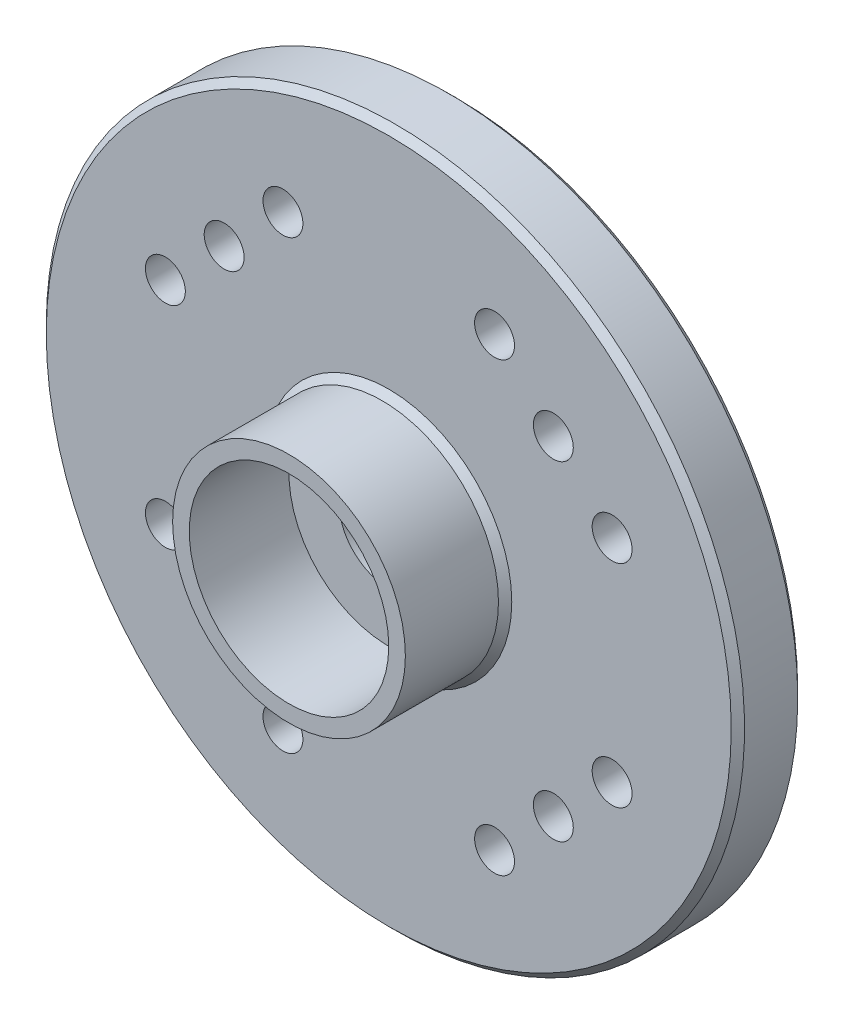
ISO-10303-21;
HEADER;
FILE_DESCRIPTION(('STEP AP214'),'2;1');
FILE_NAME('part.step','',(''),(''),'','','');
FILE_SCHEMA(('AUTOMOTIVE_DESIGN { 1 0 10303 214 1 1 1 1 }'));
ENDSEC;
DATA;
#1=APPLICATION_CONTEXT('core data for automotive mechanical design processes');
#2=APPLICATION_PROTOCOL_DEFINITION('international standard','automotive_design',2000,#1);
#3=PRODUCT_CONTEXT('',#1,'mechanical');
#4=PRODUCT('Part','Part','',(#3));
#5=PRODUCT_RELATED_PRODUCT_CATEGORY('part','',(#4));
#6=PRODUCT_DEFINITION_FORMATION('','',#4);
#7=PRODUCT_DEFINITION_CONTEXT('part definition',#1,'design');
#8=PRODUCT_DEFINITION('design','',#6,#7);
#9=PRODUCT_DEFINITION_SHAPE('','',#8);
#10=(LENGTH_UNIT() NAMED_UNIT(*) SI_UNIT(.MILLI.,.METRE.));
#11=(NAMED_UNIT(*) PLANE_ANGLE_UNIT() SI_UNIT($,.RADIAN.));
#12=(NAMED_UNIT(*) SI_UNIT($,.STERADIAN.) SOLID_ANGLE_UNIT());
#13=UNCERTAINTY_MEASURE_WITH_UNIT(LENGTH_MEASURE(1.E-05),#10,'distance_accuracy_value','');
#14=(GEOMETRIC_REPRESENTATION_CONTEXT(3) GLOBAL_UNCERTAINTY_ASSIGNED_CONTEXT((#13)) GLOBAL_UNIT_ASSIGNED_CONTEXT((#10,
#11,#12)) REPRESENTATION_CONTEXT('',''));
#15=CARTESIAN_POINT('',(0.,0.,0.));
#16=DIRECTION('',(0.,0.,1.));
#17=DIRECTION('',(1.,0.,0.));
#18=AXIS2_PLACEMENT_3D('',#15,#16,#17);
#19=CARTESIAN_POINT('',(0.,0.,2.));
#20=DIRECTION('',(0.,0.,-1.));
#21=DIRECTION('',(-1.,0.,0.));
#22=AXIS2_PLACEMENT_3D('',#19,#20,#21);
#23=CYLINDRICAL_SURFACE('',#22,1.5);
#24=CARTESIAN_POINT('',(0.,0.,2.));
#25=DIRECTION('',(0.,0.,1.));
#26=DIRECTION('',(1.,0.,0.));
#27=AXIS2_PLACEMENT_3D('',#24,#25,#26);
#28=CIRCLE('',#27,1.5);
#29=CARTESIAN_POINT('',(1.5,0.,2.));
#30=VERTEX_POINT('',#29);
#31=EDGE_CURVE('E71',#30,#30,#28,.T.);
#32=ORIENTED_EDGE('',*,*,#31,.T.);
#33=EDGE_LOOP('',(#32));
#34=FACE_BOUND('',#33,.T.);
#35=CARTESIAN_POINT('',(0.,0.,1.));
#36=DIRECTION('',(0.,0.,-1.));
#37=DIRECTION('',(-1.,0.,0.));
#38=AXIS2_PLACEMENT_3D('',#35,#36,#37);
#39=CIRCLE('',#38,1.5);
#40=CARTESIAN_POINT('',(-1.5,0.,1.));
#41=VERTEX_POINT('',#40);
#42=EDGE_CURVE('E64',#41,#41,#39,.T.);
#43=ORIENTED_EDGE('',*,*,#42,.T.);
#44=EDGE_LOOP('',(#43));
#45=FACE_BOUND('',#44,.T.);
#46=ADVANCED_FACE('F36',(#34,#45),#23,.F.);
#47=CARTESIAN_POINT('',(0.,0.,2.));
#48=DIRECTION('',(0.,0.,1.));
#49=DIRECTION('',(1.,0.,0.));
#50=AXIS2_PLACEMENT_3D('',#47,#48,#49);
#51=PLANE('',#50);
#52=ORIENTED_EDGE('',*,*,#31,.F.);
#53=EDGE_LOOP('',(#52));
#54=FACE_BOUND('',#53,.T.);
#55=CARTESIAN_POINT('',(0.,0.,2.));
#56=DIRECTION('',(0.,0.,1.));
#57=DIRECTION('',(1.,0.,0.));
#58=AXIS2_PLACEMENT_3D('',#55,#56,#57);
#59=CIRCLE('',#58,3.);
#60=CARTESIAN_POINT('',(3.,0.,2.));
#61=VERTEX_POINT('',#60);
#62=EDGE_CURVE('E63',#61,#61,#59,.F.);
#63=ORIENTED_EDGE('',*,*,#62,.F.);
#64=EDGE_LOOP('',(#63));
#65=FACE_BOUND('',#64,.T.);
#66=ADVANCED_FACE('F171',(#54,#65),#51,.T.);
#67=CARTESIAN_POINT('',(0.,0.,2.));
#68=DIRECTION('',(0.,0.,1.));
#69=DIRECTION('',(1.,0.,0.));
#70=AXIS2_PLACEMENT_3D('',#67,#68,#69);
#71=CIRCLE('',#70,3.69999999999999);
#72=CARTESIAN_POINT('',(3.69999999999999,0.,2.));
#73=VERTEX_POINT('',#72);
#74=EDGE_CURVE('E52',#73,#73,#71,.F.);
#75=ORIENTED_EDGE('',*,*,#74,.T.);
#76=EDGE_LOOP('',(#75));
#77=FACE_BOUND('',#76,.T.);
#78=CARTESIAN_POINT('',(0.,0.,2.));
#79=DIRECTION('',(0.,0.,1.));
#80=DIRECTION('',(1.,0.,0.));
#81=AXIS2_PLACEMENT_3D('',#78,#79,#80);
#82=CIRCLE('',#81,10.3);
#83=CARTESIAN_POINT('',(-10.3,0.,2.));
#84=VERTEX_POINT('',#83);
#85=EDGE_CURVE('E57',#84,#84,#82,.T.);
#86=ORIENTED_EDGE('',*,*,#85,.T.);
#87=EDGE_LOOP('',(#86));
#88=FACE_BOUND('',#87,.T.);
#89=CARTESIAN_POINT('',(-6.7175144212722,3.18198051533946,2.));
#90=DIRECTION('',(0.,0.,1.));
#91=DIRECTION('',(-1.,0.,0.));
#92=AXIS2_PLACEMENT_3D('',#89,#90,#91);
#93=CIRCLE('',#92,0.6);
#94=CARTESIAN_POINT('',(-7.3175144212722,3.18198051533946,2.));
#95=VERTEX_POINT('',#94);
#96=EDGE_CURVE('E122',#95,#95,#93,.T.);
#97=ORIENTED_EDGE('',*,*,#96,.F.);
#98=EDGE_LOOP('',(#97));
#99=FACE_BOUND('',#98,.T.);
#100=CARTESIAN_POINT('',(6.7175144212724,3.18198051534006,2.));
#101=DIRECTION('',(0.,0.,1.));
#102=DIRECTION('',(1.,0.,0.));
#103=AXIS2_PLACEMENT_3D('',#100,#101,#102);
#104=CIRCLE('',#103,0.6);
#105=CARTESIAN_POINT('',(7.3175144212724,3.18198051534006,2.));
#106=VERTEX_POINT('',#105);
#107=EDGE_CURVE('E115',#106,#106,#104,.T.);
#108=ORIENTED_EDGE('',*,*,#107,.F.);
#109=EDGE_LOOP('',(#108));
#110=FACE_BOUND('',#109,.T.);
#111=CARTESIAN_POINT('',(3.18198051533966,6.71751442127279,2.));
#112=DIRECTION('',(0.,0.,1.));
#113=DIRECTION('',(-1.,0.,0.));
#114=AXIS2_PLACEMENT_3D('',#111,#112,#113);
#115=CIRCLE('',#114,0.600000000000001);
#116=CARTESIAN_POINT('',(2.58198051533966,6.71751442127279,2.));
#117=VERTEX_POINT('',#116);
#118=EDGE_CURVE('E134',#117,#117,#115,.T.);
#119=ORIENTED_EDGE('',*,*,#118,.F.);
#120=EDGE_LOOP('',(#119));
#121=FACE_BOUND('',#120,.T.);
#122=CARTESIAN_POINT('',(3.18198051534026,-6.71751442127181,2.));
#123=DIRECTION('',(0.,0.,1.));
#124=DIRECTION('',(1.,0.,0.));
#125=AXIS2_PLACEMENT_3D('',#122,#123,#124);
#126=CIRCLE('',#125,0.600000000000001);
#127=CARTESIAN_POINT('',(3.78198051534026,-6.71751442127181,2.));
#128=VERTEX_POINT('',#127);
#129=EDGE_CURVE('E127',#128,#128,#126,.T.);
#130=ORIENTED_EDGE('',*,*,#129,.F.);
#131=EDGE_LOOP('',(#130));
#132=FACE_BOUND('',#131,.T.);
#133=CARTESIAN_POINT('',(4.94974746830583,4.94974746830583,2.));
#134=DIRECTION('',(0.,0.,1.));
#135=DIRECTION('',(1.,0.,0.));
#136=AXIS2_PLACEMENT_3D('',#133,#134,#135);
#137=CIRCLE('',#136,0.6);
#138=CARTESIAN_POINT('',(5.54974746830583,4.94974746830583,2.));
#139=VERTEX_POINT('',#138);
#140=EDGE_CURVE('E98',#139,#139,#137,.T.);
#141=ORIENTED_EDGE('',*,*,#140,.F.);
#142=EDGE_LOOP('',(#141));
#143=FACE_BOUND('',#142,.T.);
#144=CARTESIAN_POINT('',(-4.94974746830583,-4.94974746830583,2.));
#145=DIRECTION('',(0.,0.,1.));
#146=DIRECTION('',(1.,0.,0.));
#147=AXIS2_PLACEMENT_3D('',#144,#145,#146);
#148=CIRCLE('',#147,0.6);
#149=CARTESIAN_POINT('',(-4.34974746830583,-4.94974746830583,2.));
#150=VERTEX_POINT('',#149);
#151=EDGE_CURVE('E91',#150,#150,#148,.T.);
#152=ORIENTED_EDGE('',*,*,#151,.F.);
#153=EDGE_LOOP('',(#152));
#154=FACE_BOUND('',#153,.T.);
#155=CARTESIAN_POINT('',(4.94974746830583,-4.94974746830583,2.));
#156=DIRECTION('',(0.,0.,1.));
#157=DIRECTION('',(1.,0.,0.));
#158=AXIS2_PLACEMENT_3D('',#155,#156,#157);
#159=CIRCLE('',#158,0.6);
#160=CARTESIAN_POINT('',(5.54974746830583,-4.94974746830583,2.));
#161=VERTEX_POINT('',#160);
#162=EDGE_CURVE('E110',#161,#161,#159,.T.);
#163=ORIENTED_EDGE('',*,*,#162,.F.);
#164=EDGE_LOOP('',(#163));
#165=FACE_BOUND('',#164,.T.);
#166=CARTESIAN_POINT('',(-3.18198051533946,6.7175144212722,2.));
#167=DIRECTION('',(0.,0.,1.));
#168=DIRECTION('',(1.,0.,0.));
#169=AXIS2_PLACEMENT_3D('',#166,#167,#168);
#170=CIRCLE('',#169,0.6);
#171=CARTESIAN_POINT('',(-2.58198051533947,6.7175144212722,2.));
#172=VERTEX_POINT('',#171);
#173=EDGE_CURVE('E103',#172,#172,#170,.T.);
#174=ORIENTED_EDGE('',*,*,#173,.F.);
#175=EDGE_LOOP('',(#174));
#176=FACE_BOUND('',#175,.T.);
#177=CARTESIAN_POINT('',(6.717514421273,-3.18198051533907,2.));
#178=DIRECTION('',(0.,0.,1.));
#179=DIRECTION('',(-1.,0.,0.));
#180=AXIS2_PLACEMENT_3D('',#177,#178,#179);
#181=CIRCLE('',#180,0.6);
#182=CARTESIAN_POINT('',(6.117514421273,-3.18198051533907,2.));
#183=VERTEX_POINT('',#182);
#184=EDGE_CURVE('E151',#183,#183,#181,.T.);
#185=ORIENTED_EDGE('',*,*,#184,.F.);
#186=EDGE_LOOP('',(#185));
#187=FACE_BOUND('',#186,.T.);
#188=CARTESIAN_POINT('',(-6.71751442127161,-3.18198051533967,2.));
#189=DIRECTION('',(0.,0.,1.));
#190=DIRECTION('',(1.,0.,0.));
#191=AXIS2_PLACEMENT_3D('',#188,#189,#190);
#192=CIRCLE('',#191,0.6);
#193=CARTESIAN_POINT('',(-6.11751442127161,-3.18198051533967,2.));
#194=VERTEX_POINT('',#193);
#195=EDGE_CURVE('E145',#194,#194,#192,.T.);
#196=ORIENTED_EDGE('',*,*,#195,.F.);
#197=EDGE_LOOP('',(#196));
#198=FACE_BOUND('',#197,.T.);
#199=CARTESIAN_POINT('',(-3.18198051533887,-6.7175144212724,2.));
#200=DIRECTION('',(0.,0.,1.));
#201=DIRECTION('',(-1.,0.,0.));
#202=AXIS2_PLACEMENT_3D('',#199,#200,#201);
#203=CIRCLE('',#202,0.6);
#204=CARTESIAN_POINT('',(-3.78198051533887,-6.7175144212724,2.));
#205=VERTEX_POINT('',#204);
#206=EDGE_CURVE('E139',#205,#205,#203,.T.);
#207=ORIENTED_EDGE('',*,*,#206,.F.);
#208=EDGE_LOOP('',(#207));
#209=FACE_BOUND('',#208,.T.);
#210=CARTESIAN_POINT('',(-4.94974746830583,4.94974746830583,2.));
#211=DIRECTION('',(0.,0.,1.));
#212=DIRECTION('',(1.,0.,0.));
#213=AXIS2_PLACEMENT_3D('',#210,#211,#212);
#214=CIRCLE('',#213,0.6);
#215=CARTESIAN_POINT('',(-4.34974746830583,4.94974746830583,2.));
#216=VERTEX_POINT('',#215);
#217=EDGE_CURVE('E85',#216,#216,#214,.T.);
#218=ORIENTED_EDGE('',*,*,#217,.F.);
#219=EDGE_LOOP('',(#218));
#220=FACE_BOUND('',#219,.T.);
#221=ADVANCED_FACE('F168',(#77,#88,#99,#110,#121,#132,#143,#154,#165,#176,#187,#198,#209,#220),
#51,.T.);
#222=CARTESIAN_POINT('',(0.,0.,0.));
#223=DIRECTION('',(0.,0.,1.));
#224=DIRECTION('',(1.,0.,0.));
#225=AXIS2_PLACEMENT_3D('',#222,#223,#224);
#226=PLANE('',#225);
#227=CARTESIAN_POINT('',(0.,0.,0.));
#228=DIRECTION('',(0.,0.,1.));
#229=DIRECTION('',(1.,0.,0.));
#230=AXIS2_PLACEMENT_3D('',#227,#228,#229);
#231=CIRCLE('',#230,10.3);
#232=CARTESIAN_POINT('',(10.3,0.,0.));
#233=VERTEX_POINT('',#232);
#234=EDGE_CURVE('E10',#233,#233,#231,.F.);
#235=ORIENTED_EDGE('',*,*,#234,.T.);
#236=EDGE_LOOP('',(#235));
#237=FACE_BOUND('',#236,.T.);
#238=CARTESIAN_POINT('',(-6.7175144212722,3.18198051533946,0.));
#239=DIRECTION('',(0.,0.,1.));
#240=DIRECTION('',(-1.,0.,0.));
#241=AXIS2_PLACEMENT_3D('',#238,#239,#240);
#242=CIRCLE('',#241,0.6);
#243=CARTESIAN_POINT('',(-7.3175144212722,3.18198051533946,0.));
#244=VERTEX_POINT('',#243);
#245=EDGE_CURVE('E107',#244,#244,#242,.T.);
#246=ORIENTED_EDGE('',*,*,#245,.T.);
#247=EDGE_LOOP('',(#246));
#248=FACE_BOUND('',#247,.T.);
#249=CARTESIAN_POINT('',(6.7175144212724,3.18198051534006,0.));
#250=DIRECTION('',(0.,0.,1.));
#251=DIRECTION('',(1.,0.,0.));
#252=AXIS2_PLACEMENT_3D('',#249,#250,#251);
#253=CIRCLE('',#252,0.6);
#254=CARTESIAN_POINT('',(7.3175144212724,3.18198051534006,0.));
#255=VERTEX_POINT('',#254);
#256=EDGE_CURVE('E118',#255,#255,#253,.T.);
#257=ORIENTED_EDGE('',*,*,#256,.T.);
#258=EDGE_LOOP('',(#257));
#259=FACE_BOUND('',#258,.T.);
#260=CARTESIAN_POINT('',(3.18198051533966,6.71751442127279,0.));
#261=DIRECTION('',(0.,0.,1.));
#262=DIRECTION('',(-1.,0.,0.));
#263=AXIS2_PLACEMENT_3D('',#260,#261,#262);
#264=CIRCLE('',#263,0.600000000000001);
#265=CARTESIAN_POINT('',(2.58198051533966,6.71751442127279,0.));
#266=VERTEX_POINT('',#265);
#267=EDGE_CURVE('E119',#266,#266,#264,.T.);
#268=ORIENTED_EDGE('',*,*,#267,.T.);
#269=EDGE_LOOP('',(#268));
#270=FACE_BOUND('',#269,.T.);
#271=CARTESIAN_POINT('',(3.18198051534026,-6.71751442127181,0.));
#272=DIRECTION('',(0.,0.,1.));
#273=DIRECTION('',(1.,0.,0.));
#274=AXIS2_PLACEMENT_3D('',#271,#272,#273);
#275=CIRCLE('',#274,0.600000000000001);
#276=CARTESIAN_POINT('',(3.78198051534026,-6.71751442127181,0.));
#277=VERTEX_POINT('',#276);
#278=EDGE_CURVE('E130',#277,#277,#275,.T.);
#279=ORIENTED_EDGE('',*,*,#278,.T.);
#280=EDGE_LOOP('',(#279));
#281=FACE_BOUND('',#280,.T.);
#282=CARTESIAN_POINT('',(4.94974746830583,4.94974746830583,0.));
#283=DIRECTION('',(0.,0.,1.));
#284=DIRECTION('',(1.,0.,0.));
#285=AXIS2_PLACEMENT_3D('',#282,#283,#284);
#286=CIRCLE('',#285,0.6);
#287=CARTESIAN_POINT('',(5.54974746830583,4.94974746830583,0.));
#288=VERTEX_POINT('',#287);
#289=EDGE_CURVE('E88',#288,#288,#286,.T.);
#290=ORIENTED_EDGE('',*,*,#289,.T.);
#291=EDGE_LOOP('',(#290));
#292=FACE_BOUND('',#291,.T.);
#293=CARTESIAN_POINT('',(-4.94974746830583,-4.94974746830583,0.));
#294=DIRECTION('',(0.,0.,1.));
#295=DIRECTION('',(1.,0.,0.));
#296=AXIS2_PLACEMENT_3D('',#293,#294,#295);
#297=CIRCLE('',#296,0.6);
#298=CARTESIAN_POINT('',(-4.34974746830583,-4.94974746830583,0.));
#299=VERTEX_POINT('',#298);
#300=EDGE_CURVE('E94',#299,#299,#297,.T.);
#301=ORIENTED_EDGE('',*,*,#300,.T.);
#302=EDGE_LOOP('',(#301));
#303=FACE_BOUND('',#302,.T.);
#304=CARTESIAN_POINT('',(4.94974746830583,-4.94974746830583,0.));
#305=DIRECTION('',(0.,0.,1.));
#306=DIRECTION('',(1.,0.,0.));
#307=AXIS2_PLACEMENT_3D('',#304,#305,#306);
#308=CIRCLE('',#307,0.6);
#309=CARTESIAN_POINT('',(5.54974746830583,-4.94974746830583,0.));
#310=VERTEX_POINT('',#309);
#311=EDGE_CURVE('E95',#310,#310,#308,.T.);
#312=ORIENTED_EDGE('',*,*,#311,.T.);
#313=EDGE_LOOP('',(#312));
#314=FACE_BOUND('',#313,.T.);
#315=CARTESIAN_POINT('',(-3.18198051533946,6.7175144212722,0.));
#316=DIRECTION('',(0.,0.,1.));
#317=DIRECTION('',(1.,0.,0.));
#318=AXIS2_PLACEMENT_3D('',#315,#316,#317);
#319=CIRCLE('',#318,0.6);
#320=CARTESIAN_POINT('',(-2.58198051533947,6.7175144212722,0.));
#321=VERTEX_POINT('',#320);
#322=EDGE_CURVE('E106',#321,#321,#319,.T.);
#323=ORIENTED_EDGE('',*,*,#322,.T.);
#324=EDGE_LOOP('',(#323));
#325=FACE_BOUND('',#324,.T.);
#326=CARTESIAN_POINT('',(6.717514421273,-3.18198051533907,0.));
#327=DIRECTION('',(0.,0.,1.));
#328=DIRECTION('',(-1.,0.,0.));
#329=AXIS2_PLACEMENT_3D('',#326,#327,#328);
#330=CIRCLE('',#329,0.6);
#331=CARTESIAN_POINT('',(6.117514421273,-3.18198051533907,0.));
#332=VERTEX_POINT('',#331);
#333=EDGE_CURVE('E131',#332,#332,#330,.T.);
#334=ORIENTED_EDGE('',*,*,#333,.T.);
#335=EDGE_LOOP('',(#334));
#336=FACE_BOUND('',#335,.T.);
#337=CARTESIAN_POINT('',(-6.71751442127161,-3.18198051533967,0.));
#338=DIRECTION('',(0.,0.,1.));
#339=DIRECTION('',(1.,0.,0.));
#340=AXIS2_PLACEMENT_3D('',#337,#338,#339);
#341=CIRCLE('',#340,0.6);
#342=CARTESIAN_POINT('',(-6.11751442127161,-3.18198051533967,0.));
#343=VERTEX_POINT('',#342);
#344=EDGE_CURVE('E148',#343,#343,#341,.T.);
#345=ORIENTED_EDGE('',*,*,#344,.T.);
#346=EDGE_LOOP('',(#345));
#347=FACE_BOUND('',#346,.T.);
#348=CARTESIAN_POINT('',(-3.18198051533887,-6.7175144212724,0.));
#349=DIRECTION('',(0.,0.,1.));
#350=DIRECTION('',(-1.,0.,0.));
#351=AXIS2_PLACEMENT_3D('',#348,#349,#350);
#352=CIRCLE('',#351,0.6);
#353=CARTESIAN_POINT('',(-3.78198051533887,-6.7175144212724,0.));
#354=VERTEX_POINT('',#353);
#355=EDGE_CURVE('E142',#354,#354,#352,.T.);
#356=ORIENTED_EDGE('',*,*,#355,.T.);
#357=EDGE_LOOP('',(#356));
#358=FACE_BOUND('',#357,.T.);
#359=CARTESIAN_POINT('',(-4.94974746830583,4.94974746830583,0.));
#360=DIRECTION('',(0.,0.,1.));
#361=DIRECTION('',(1.,0.,0.));
#362=AXIS2_PLACEMENT_3D('',#359,#360,#361);
#363=CIRCLE('',#362,0.6);
#364=CARTESIAN_POINT('',(-4.34974746830583,4.94974746830583,0.));
#365=VERTEX_POINT('',#364);
#366=EDGE_CURVE('E82',#365,#365,#363,.T.);
#367=ORIENTED_EDGE('',*,*,#366,.T.);
#368=EDGE_LOOP('',(#367));
#369=FACE_BOUND('',#368,.T.);
#370=CARTESIAN_POINT('',(0.,0.,0.));
#371=DIRECTION('',(0.,0.,-1.));
#372=DIRECTION('',(-1.,0.,0.));
#373=AXIS2_PLACEMENT_3D('',#370,#371,#372);
#374=CIRCLE('',#373,3.);
#375=CARTESIAN_POINT('',(-3.,0.,0.));
#376=VERTEX_POINT('',#375);
#377=EDGE_CURVE('E79',#376,#376,#374,.T.);
#378=ORIENTED_EDGE('',*,*,#377,.F.);
#379=EDGE_LOOP('',(#378));
#380=FACE_BOUND('',#379,.T.);
#381=ADVANCED_FACE('F157',(#237,#248,#259,#270,#281,#292,#303,#314,#325,#336,#347,#358,#369,
#380),#226,.F.);
#382=CARTESIAN_POINT('',(0.,0.,2.));
#383=DIRECTION('',(0.,0.,-1.));
#384=DIRECTION('',(-1.,0.,0.));
#385=AXIS2_PLACEMENT_3D('',#382,#383,#384);
#386=CYLINDRICAL_SURFACE('',#385,10.5);
#387=CARTESIAN_POINT('',(0.,0.,0.199999999999997));
#388=DIRECTION('',(0.,0.,1.));
#389=DIRECTION('',(1.,0.,0.));
#390=AXIS2_PLACEMENT_3D('',#387,#388,#389);
#391=CIRCLE('',#390,10.5);
#392=CARTESIAN_POINT('',(10.5,0.,0.199999999999997));
#393=VERTEX_POINT('',#392);
#394=EDGE_CURVE('E44',#393,#393,#391,.T.);
#395=ORIENTED_EDGE('',*,*,#394,.T.);
#396=EDGE_LOOP('',(#395));
#397=FACE_BOUND('',#396,.T.);
#398=CARTESIAN_POINT('',(0.,0.,1.79999999999999));
#399=DIRECTION('',(0.,0.,1.));
#400=DIRECTION('',(1.,0.,0.));
#401=AXIS2_PLACEMENT_3D('',#398,#399,#400);
#402=CIRCLE('',#401,10.5);
#403=CARTESIAN_POINT('',(-10.5,0.,1.79999999999999));
#404=VERTEX_POINT('',#403);
#405=EDGE_CURVE('E48',#404,#404,#402,.F.);
#406=ORIENTED_EDGE('',*,*,#405,.T.);
#407=EDGE_LOOP('',(#406));
#408=FACE_BOUND('',#407,.T.);
#409=ADVANCED_FACE('F211',(#397,#408),#386,.T.);
#410=CARTESIAN_POINT('',(0.,0.,5.));
#411=DIRECTION('',(0.,0.,1.));
#412=DIRECTION('',(1.,0.,0.));
#413=AXIS2_PLACEMENT_3D('',#410,#411,#412);
#414=PLANE('',#413);
#415=CARTESIAN_POINT('',(0.,0.,5.));
#416=DIRECTION('',(0.,0.,1.));
#417=DIRECTION('',(1.,0.,0.));
#418=AXIS2_PLACEMENT_3D('',#415,#416,#417);
#419=CIRCLE('',#418,3.5);
#420=CARTESIAN_POINT('',(3.5,0.,5.));
#421=VERTEX_POINT('',#420);
#422=EDGE_CURVE('E74',#421,#421,#419,.T.);
#423=ORIENTED_EDGE('',*,*,#422,.T.);
#424=EDGE_LOOP('',(#423));
#425=FACE_BOUND('',#424,.T.);
#426=CARTESIAN_POINT('',(0.,0.,5.));
#427=DIRECTION('',(0.,0.,1.));
#428=DIRECTION('',(1.,0.,0.));
#429=AXIS2_PLACEMENT_3D('',#426,#427,#428);
#430=CIRCLE('',#429,3.);
#431=CARTESIAN_POINT('',(3.,0.,5.));
#432=VERTEX_POINT('',#431);
#433=EDGE_CURVE('E67',#432,#432,#430,.T.);
#434=ORIENTED_EDGE('',*,*,#433,.F.);
#435=EDGE_LOOP('',(#434));
#436=FACE_BOUND('',#435,.T.);
#437=ADVANCED_FACE('F214',(#425,#436),#414,.T.);
#438=CARTESIAN_POINT('',(0.,0.,5.));
#439=DIRECTION('',(0.,0.,-1.));
#440=DIRECTION('',(-1.,0.,0.));
#441=AXIS2_PLACEMENT_3D('',#438,#439,#440);
#442=CYLINDRICAL_SURFACE('',#441,3.5);
#443=CARTESIAN_POINT('',(0.,0.,2.2));
#444=DIRECTION('',(0.,0.,1.));
#445=DIRECTION('',(1.,0.,0.));
#446=AXIS2_PLACEMENT_3D('',#443,#444,#445);
#447=CIRCLE('',#446,3.5);
#448=CARTESIAN_POINT('',(3.5,0.,2.2));
#449=VERTEX_POINT('',#448);
#450=EDGE_CURVE('E60',#449,#449,#447,.T.);
#451=ORIENTED_EDGE('',*,*,#450,.T.);
#452=EDGE_LOOP('',(#451));
#453=FACE_BOUND('',#452,.T.);
#454=ORIENTED_EDGE('',*,*,#422,.F.);
#455=EDGE_LOOP('',(#454));
#456=FACE_BOUND('',#455,.T.);
#457=ADVANCED_FACE('F206',(#453,#456),#442,.T.);
#458=CARTESIAN_POINT('',(0.,0.,5.));
#459=DIRECTION('',(0.,0.,-1.));
#460=DIRECTION('',(-1.,0.,0.));
#461=AXIS2_PLACEMENT_3D('',#458,#459,#460);
#462=CYLINDRICAL_SURFACE('',#461,3.);
#463=ORIENTED_EDGE('',*,*,#433,.T.);
#464=EDGE_LOOP('',(#463));
#465=FACE_BOUND('',#464,.T.);
#466=ORIENTED_EDGE('',*,*,#62,.T.);
#467=EDGE_LOOP('',(#466));
#468=FACE_BOUND('',#467,.T.);
#469=ADVANCED_FACE('F341',(#465,#468),#462,.F.);
#470=CARTESIAN_POINT('',(0.,0.,1.));
#471=DIRECTION('',(0.,0.,-1.));
#472=DIRECTION('',(-1.,0.,0.));
#473=AXIS2_PLACEMENT_3D('',#470,#471,#472);
#474=CYLINDRICAL_SURFACE('',#473,3.);
#475=CARTESIAN_POINT('',(0.,0.,1.));
#476=DIRECTION('',(0.,0.,-1.));
#477=DIRECTION('',(-1.,0.,0.));
#478=AXIS2_PLACEMENT_3D('',#475,#476,#477);
#479=CIRCLE('',#478,3.);
#480=CARTESIAN_POINT('',(-3.,0.,1.));
#481=VERTEX_POINT('',#480);
#482=EDGE_CURVE('E68',#481,#481,#479,.T.);
#483=ORIENTED_EDGE('',*,*,#482,.F.);
#484=EDGE_LOOP('',(#483));
#485=FACE_BOUND('',#484,.T.);
#486=ORIENTED_EDGE('',*,*,#377,.T.);
#487=EDGE_LOOP('',(#486));
#488=FACE_BOUND('',#487,.T.);
#489=ADVANCED_FACE('F192',(#485,#488),#474,.F.);
#490=CARTESIAN_POINT('',(0.,0.,1.));
#491=DIRECTION('',(0.,0.,-1.));
#492=DIRECTION('',(-1.,0.,0.));
#493=AXIS2_PLACEMENT_3D('',#490,#491,#492);
#494=PLANE('',#493);
#495=ORIENTED_EDGE('',*,*,#42,.F.);
#496=EDGE_LOOP('',(#495));
#497=FACE_BOUND('',#496,.T.);
#498=ORIENTED_EDGE('',*,*,#482,.T.);
#499=EDGE_LOOP('',(#498));
#500=FACE_BOUND('',#499,.T.);
#501=ADVANCED_FACE('F183',(#497,#500),#494,.T.);
#502=CARTESIAN_POINT('',(-4.94974746830583,4.94974746830583,0.));
#503=DIRECTION('',(0.,0.,1.));
#504=DIRECTION('',(1.,0.,0.));
#505=AXIS2_PLACEMENT_3D('',#502,#503,#504);
#506=CYLINDRICAL_SURFACE('',#505,0.6);
#507=ORIENTED_EDGE('',*,*,#366,.F.);
#508=EDGE_LOOP('',(#507));
#509=FACE_BOUND('',#508,.T.);
#510=ORIENTED_EDGE('',*,*,#217,.T.);
#511=EDGE_LOOP('',(#510));
#512=FACE_BOUND('',#511,.T.);
#513=ADVANCED_FACE('F180',(#509,#512),#506,.F.);
#514=CARTESIAN_POINT('',(-3.18198051533887,-6.7175144212724,0.));
#515=DIRECTION('',(0.,0.,1.));
#516=DIRECTION('',(1.,0.,0.));
#517=AXIS2_PLACEMENT_3D('',#514,#515,#516);
#518=CYLINDRICAL_SURFACE('',#517,0.6);
#519=ORIENTED_EDGE('',*,*,#355,.F.);
#520=EDGE_LOOP('',(#519));
#521=FACE_BOUND('',#520,.T.);
#522=ORIENTED_EDGE('',*,*,#206,.T.);
#523=EDGE_LOOP('',(#522));
#524=FACE_BOUND('',#523,.T.);
#525=ADVANCED_FACE('F182',(#521,#524),#518,.F.);
#526=CARTESIAN_POINT('',(-6.71751442127161,-3.18198051533967,0.));
#527=DIRECTION('',(0.,0.,1.));
#528=DIRECTION('',(1.,0.,0.));
#529=AXIS2_PLACEMENT_3D('',#526,#527,#528);
#530=CYLINDRICAL_SURFACE('',#529,0.6);
#531=ORIENTED_EDGE('',*,*,#344,.F.);
#532=EDGE_LOOP('',(#531));
#533=FACE_BOUND('',#532,.T.);
#534=ORIENTED_EDGE('',*,*,#195,.T.);
#535=EDGE_LOOP('',(#534));
#536=FACE_BOUND('',#535,.T.);
#537=ADVANCED_FACE('F164',(#533,#536),#530,.F.);
#538=CARTESIAN_POINT('',(6.717514421273,-3.18198051533907,0.));
#539=DIRECTION('',(0.,0.,1.));
#540=DIRECTION('',(1.,0.,0.));
#541=AXIS2_PLACEMENT_3D('',#538,#539,#540);
#542=CYLINDRICAL_SURFACE('',#541,0.6);
#543=ORIENTED_EDGE('',*,*,#333,.F.);
#544=EDGE_LOOP('',(#543));
#545=FACE_BOUND('',#544,.T.);
#546=ORIENTED_EDGE('',*,*,#184,.T.);
#547=EDGE_LOOP('',(#546));
#548=FACE_BOUND('',#547,.T.);
#549=ADVANCED_FACE('F160',(#545,#548),#542,.F.);
#550=CARTESIAN_POINT('',(-3.18198051533946,6.7175144212722,0.));
#551=DIRECTION('',(0.,0.,1.));
#552=DIRECTION('',(1.,0.,0.));
#553=AXIS2_PLACEMENT_3D('',#550,#551,#552);
#554=CYLINDRICAL_SURFACE('',#553,0.6);
#555=ORIENTED_EDGE('',*,*,#322,.F.);
#556=EDGE_LOOP('',(#555));
#557=FACE_BOUND('',#556,.T.);
#558=ORIENTED_EDGE('',*,*,#173,.T.);
#559=EDGE_LOOP('',(#558));
#560=FACE_BOUND('',#559,.T.);
#561=ADVANCED_FACE('F163',(#557,#560),#554,.F.);
#562=CARTESIAN_POINT('',(4.94974746830583,-4.94974746830583,0.));
#563=DIRECTION('',(0.,0.,1.));
#564=DIRECTION('',(1.,0.,0.));
#565=AXIS2_PLACEMENT_3D('',#562,#563,#564);
#566=CYLINDRICAL_SURFACE('',#565,0.6);
#567=ORIENTED_EDGE('',*,*,#311,.F.);
#568=EDGE_LOOP('',(#567));
#569=FACE_BOUND('',#568,.T.);
#570=ORIENTED_EDGE('',*,*,#162,.T.);
#571=EDGE_LOOP('',(#570));
#572=FACE_BOUND('',#571,.T.);
#573=ADVANCED_FACE('F257',(#569,#572),#566,.F.);
#574=CARTESIAN_POINT('',(-4.94974746830583,-4.94974746830583,0.));
#575=DIRECTION('',(0.,0.,1.));
#576=DIRECTION('',(1.,0.,0.));
#577=AXIS2_PLACEMENT_3D('',#574,#575,#576);
#578=CYLINDRICAL_SURFACE('',#577,0.6);
#579=ORIENTED_EDGE('',*,*,#300,.F.);
#580=EDGE_LOOP('',(#579));
#581=FACE_BOUND('',#580,.T.);
#582=ORIENTED_EDGE('',*,*,#151,.T.);
#583=EDGE_LOOP('',(#582));
#584=FACE_BOUND('',#583,.T.);
#585=ADVANCED_FACE('F263',(#581,#584),#578,.F.);
#586=CARTESIAN_POINT('',(4.94974746830583,4.94974746830583,0.));
#587=DIRECTION('',(0.,0.,1.));
#588=DIRECTION('',(1.,0.,0.));
#589=AXIS2_PLACEMENT_3D('',#586,#587,#588);
#590=CYLINDRICAL_SURFACE('',#589,0.6);
#591=ORIENTED_EDGE('',*,*,#289,.F.);
#592=EDGE_LOOP('',(#591));
#593=FACE_BOUND('',#592,.T.);
#594=ORIENTED_EDGE('',*,*,#140,.T.);
#595=EDGE_LOOP('',(#594));
#596=FACE_BOUND('',#595,.T.);
#597=ADVANCED_FACE('F269',(#593,#596),#590,.F.);
#598=CARTESIAN_POINT('',(3.18198051534026,-6.71751442127181,0.));
#599=DIRECTION('',(0.,0.,1.));
#600=DIRECTION('',(1.,0.,0.));
#601=AXIS2_PLACEMENT_3D('',#598,#599,#600);
#602=CYLINDRICAL_SURFACE('',#601,0.600000000000001);
#603=ORIENTED_EDGE('',*,*,#278,.F.);
#604=EDGE_LOOP('',(#603));
#605=FACE_BOUND('',#604,.T.);
#606=ORIENTED_EDGE('',*,*,#129,.T.);
#607=EDGE_LOOP('',(#606));
#608=FACE_BOUND('',#607,.T.);
#609=ADVANCED_FACE('F271',(#605,#608),#602,.F.);
#610=CARTESIAN_POINT('',(3.18198051533966,6.71751442127279,0.));
#611=DIRECTION('',(0.,0.,1.));
#612=DIRECTION('',(1.,0.,0.));
#613=AXIS2_PLACEMENT_3D('',#610,#611,#612);
#614=CYLINDRICAL_SURFACE('',#613,0.600000000000001);
#615=ORIENTED_EDGE('',*,*,#267,.F.);
#616=EDGE_LOOP('',(#615));
#617=FACE_BOUND('',#616,.T.);
#618=ORIENTED_EDGE('',*,*,#118,.T.);
#619=EDGE_LOOP('',(#618));
#620=FACE_BOUND('',#619,.T.);
#621=ADVANCED_FACE('F296',(#617,#620),#614,.F.);
#622=CARTESIAN_POINT('',(6.7175144212724,3.18198051534006,0.));
#623=DIRECTION('',(0.,0.,1.));
#624=DIRECTION('',(1.,0.,0.));
#625=AXIS2_PLACEMENT_3D('',#622,#623,#624);
#626=CYLINDRICAL_SURFACE('',#625,0.6);
#627=ORIENTED_EDGE('',*,*,#256,.F.);
#628=EDGE_LOOP('',(#627));
#629=FACE_BOUND('',#628,.T.);
#630=ORIENTED_EDGE('',*,*,#107,.T.);
#631=EDGE_LOOP('',(#630));
#632=FACE_BOUND('',#631,.T.);
#633=ADVANCED_FACE('F304',(#629,#632),#626,.F.);
#634=CARTESIAN_POINT('',(-6.7175144212722,3.18198051533946,0.));
#635=DIRECTION('',(0.,0.,1.));
#636=DIRECTION('',(1.,0.,0.));
#637=AXIS2_PLACEMENT_3D('',#634,#635,#636);
#638=CYLINDRICAL_SURFACE('',#637,0.6);
#639=ORIENTED_EDGE('',*,*,#245,.F.);
#640=EDGE_LOOP('',(#639));
#641=FACE_BOUND('',#640,.T.);
#642=ORIENTED_EDGE('',*,*,#96,.T.);
#643=EDGE_LOOP('',(#642));
#644=FACE_BOUND('',#643,.T.);
#645=ADVANCED_FACE('F222',(#641,#644),#638,.F.);
#646=CARTESIAN_POINT('',(0.,0.,2.2));
#647=DIRECTION('',(0.,0.,-1.));
#648=DIRECTION('',(-1.,0.,0.));
#649=AXIS2_PLACEMENT_3D('',#646,#647,#648);
#650=CONICAL_SURFACE('',#649,3.5,0.785398163397443);
#651=ORIENTED_EDGE('',*,*,#74,.F.);
#652=EDGE_LOOP('',(#651));
#653=FACE_BOUND('',#652,.T.);
#654=ORIENTED_EDGE('',*,*,#450,.F.);
#655=EDGE_LOOP('',(#654));
#656=FACE_BOUND('',#655,.T.);
#657=ADVANCED_FACE('F216',(#653,#656),#650,.T.);
#658=CARTESIAN_POINT('',(0.,0.,0.199999999999997));
#659=DIRECTION('',(0.,0.,1.));
#660=DIRECTION('',(1.,0.,0.));
#661=AXIS2_PLACEMENT_3D('',#658,#659,#660);
#662=CONICAL_SURFACE('',#661,10.5,0.785398163397453);
#663=ORIENTED_EDGE('',*,*,#234,.F.);
#664=EDGE_LOOP('',(#663));
#665=FACE_BOUND('',#664,.T.);
#666=ORIENTED_EDGE('',*,*,#394,.F.);
#667=EDGE_LOOP('',(#666));
#668=FACE_BOUND('',#667,.T.);
#669=ADVANCED_FACE('F221',(#665,#668),#662,.T.);
#670=CARTESIAN_POINT('',(0.,0.,2.));
#671=DIRECTION('',(0.,0.,-1.));
#672=DIRECTION('',(-1.,0.,0.));
#673=AXIS2_PLACEMENT_3D('',#670,#671,#672);
#674=CONICAL_SURFACE('',#673,10.3,0.785398163397457);
#675=CARTESIAN_POINT('',(-10.5,0.,1.79999999999999));
#676=CARTESIAN_POINT('',(-10.4979166666667,0.,1.80208333333332));
#677=CARTESIAN_POINT('',(-10.4958333333333,0.,1.80416666666666));
#678=CARTESIAN_POINT('',(-10.4916666666667,0.,1.80833333333332));
#679=CARTESIAN_POINT('',(-10.4895833333333,0.,1.81041666666666));
#680=CARTESIAN_POINT('',(-10.4854166666667,0.,1.81458333333332));
#681=CARTESIAN_POINT('',(-10.4833333333333,0.,1.81666666666666));
#682=CARTESIAN_POINT('',(-10.4791666666667,0.,1.82083333333332));
#683=CARTESIAN_POINT('',(-10.4770833333333,0.,1.82291666666666));
#684=CARTESIAN_POINT('',(-10.4729166666667,0.,1.82708333333332));
#685=CARTESIAN_POINT('',(-10.4708333333333,0.,1.82916666666666));
#686=CARTESIAN_POINT('',(-10.4666666666667,0.,1.83333333333332));
#687=CARTESIAN_POINT('',(-10.4645833333333,0.,1.83541666666666));
#688=CARTESIAN_POINT('',(-10.4604166666667,0.,1.83958333333332));
#689=CARTESIAN_POINT('',(-10.4583333333333,0.,1.84166666666666));
#690=CARTESIAN_POINT('',(-10.4541666666667,0.,1.84583333333332));
#691=CARTESIAN_POINT('',(-10.4520833333333,0.,1.84791666666666));
#692=CARTESIAN_POINT('',(-10.4479166666667,0.,1.85208333333333));
#693=CARTESIAN_POINT('',(-10.4458333333333,0.,1.85416666666666));
#694=CARTESIAN_POINT('',(-10.4416666666667,0.,1.85833333333333));
#695=CARTESIAN_POINT('',(-10.4395833333333,0.,1.86041666666666));
#696=CARTESIAN_POINT('',(-10.4354166666667,0.,1.86458333333333));
#697=CARTESIAN_POINT('',(-10.4333333333333,0.,1.86666666666666));
#698=CARTESIAN_POINT('',(-10.4291666666667,0.,1.87083333333333));
#699=CARTESIAN_POINT('',(-10.4270833333333,0.,1.87291666666666));
#700=CARTESIAN_POINT('',(-10.4229166666667,0.,1.87708333333333));
#701=CARTESIAN_POINT('',(-10.4208333333333,0.,1.87916666666666));
#702=CARTESIAN_POINT('',(-10.4166666666667,0.,1.88333333333333));
#703=CARTESIAN_POINT('',(-10.4145833333333,0.,1.88541666666666));
#704=CARTESIAN_POINT('',(-10.4104166666667,0.,1.88958333333333));
#705=CARTESIAN_POINT('',(-10.4083333333333,0.,1.89166666666666));
#706=CARTESIAN_POINT('',(-10.4041666666667,0.,1.89583333333333));
#707=CARTESIAN_POINT('',(-10.4020833333333,0.,1.89791666666666));
#708=CARTESIAN_POINT('',(-10.3979166666667,0.,1.90208333333333));
#709=CARTESIAN_POINT('',(-10.3958333333333,0.,1.90416666666666));
#710=CARTESIAN_POINT('',(-10.3916666666667,0.,1.90833333333333));
#711=CARTESIAN_POINT('',(-10.3895833333333,0.,1.91041666666666));
#712=CARTESIAN_POINT('',(-10.3854166666667,0.,1.91458333333333));
#713=CARTESIAN_POINT('',(-10.3833333333333,0.,1.91666666666666));
#714=CARTESIAN_POINT('',(-10.3791666666667,0.,1.92083333333333));
#715=CARTESIAN_POINT('',(-10.3770833333333,0.,1.92291666666666));
#716=CARTESIAN_POINT('',(-10.3729166666667,0.,1.92708333333333));
#717=CARTESIAN_POINT('',(-10.3708333333333,0.,1.92916666666666));
#718=CARTESIAN_POINT('',(-10.3666666666667,0.,1.93333333333333));
#719=CARTESIAN_POINT('',(-10.3645833333333,0.,1.93541666666666));
#720=CARTESIAN_POINT('',(-10.3604166666667,0.,1.93958333333333));
#721=CARTESIAN_POINT('',(-10.3583333333333,0.,1.94166666666666));
#722=CARTESIAN_POINT('',(-10.3541666666667,0.,1.94583333333333));
#723=CARTESIAN_POINT('',(-10.3520833333333,0.,1.94791666666666));
#724=CARTESIAN_POINT('',(-10.3479166666667,0.,1.95208333333333));
#725=CARTESIAN_POINT('',(-10.3458333333333,0.,1.95416666666666));
#726=CARTESIAN_POINT('',(-10.3416666666667,0.,1.95833333333333));
#727=CARTESIAN_POINT('',(-10.3395833333333,0.,1.96041666666666));
#728=CARTESIAN_POINT('',(-10.3354166666667,0.,1.96458333333333));
#729=CARTESIAN_POINT('',(-10.3333333333333,0.,1.96666666666666));
#730=CARTESIAN_POINT('',(-10.3291666666667,0.,1.97083333333333));
#731=CARTESIAN_POINT('',(-10.3270833333333,0.,1.97291666666667));
#732=CARTESIAN_POINT('',(-10.3229166666667,0.,1.97708333333333));
#733=CARTESIAN_POINT('',(-10.3208333333333,0.,1.97916666666667));
#734=CARTESIAN_POINT('',(-10.3166666666667,0.,1.98333333333333));
#735=CARTESIAN_POINT('',(-10.3145833333333,0.,1.98541666666667));
#736=CARTESIAN_POINT('',(-10.3104166666667,0.,1.98958333333333));
#737=CARTESIAN_POINT('',(-10.3083333333333,0.,1.99166666666667));
#738=CARTESIAN_POINT('',(-10.3041666666667,0.,1.99583333333333));
#739=CARTESIAN_POINT('',(-10.3020833333333,0.,1.99791666666667));
#740=CARTESIAN_POINT('',(-10.3,0.,2.));
#741=B_SPLINE_CURVE_WITH_KNOTS('',3,(#675,#676,#677,#678,#679,#680,#681,#682,#683,#684,#685,
#686,#687,#688,#689,#690,#691,#692,#693,#694,#695,#696,#697,#698,#699,#700,#701,#702,#703,#704,
#705,#706,#707,#708,#709,#710,#711,#712,#713,#714,#715,#716,#717,#718,#719,#720,#721,#722,#723,
#724,#725,#726,#727,#728,#729,#730,#731,#732,#733,#734,#735,#736,#737,#738,#739,#740),
.UNSPECIFIED.,.F.,.F.,(4,2,2,2,2,2,2,2,2,2,2,2,2,2,2,2,2,2,2,2,2,2,2,2,2,2,2,2,2,2,2,2,4),(0.,
0.00883883476483286,0.0176776695296645,0.0265165042944974,0.0353553390593301,0.0441941738241617,
0.0530330085889946,0.0618718433538274,0.0707106781186589,0.0795495128834918,0.0883883476483234,
0.0972271824131563,0.106066017177989,0.114904851942821,0.123743686707653,0.132582521472486,
0.141421356237318,0.150260191002151,0.159099025766984,0.167937860531815,0.176776695296648,
0.185615530061481,0.194454364826312,0.203293199591145,0.212132034355978,0.22097086912081,
0.229809703885642,0.238648538650475,0.247487373415307,0.25632620818014,0.265165042944973,
0.274003877709804,0.282842712474637),.UNSPECIFIED.);
#742=EDGE_CURVE('BSEAM39',#404,#84,#741,.T.);
#743=ORIENTED_EDGE('',*,*,#405,.F.);
#744=ORIENTED_EDGE('',*,*,#85,.F.);
#745=ORIENTED_EDGE('',*,*,#742,.T.);
#746=ORIENTED_EDGE('',*,*,#742,.F.);
#747=EDGE_LOOP('',(#743,#745,#744,#746));
#748=FACE_BOUND('',#747,.T.);
#749=ADVANCED_FACE('F39',(#748),#674,.T.);
#750=CLOSED_SHELL('',(#46,#66,#221,#381,#409,#437,#457,#469,#489,#501,#513,#525,#537,#549,#561,
#573,#585,#597,#609,#621,#633,#645,#657,#669,#749));
#751=MANIFOLD_SOLID_BREP('B2',#750);
#752=ADVANCED_BREP_SHAPE_REPRESENTATION('',(#18,#751),#14);
#753=SHAPE_DEFINITION_REPRESENTATION(#9,#752);
ENDSEC;
END-ISO-10303-21;
